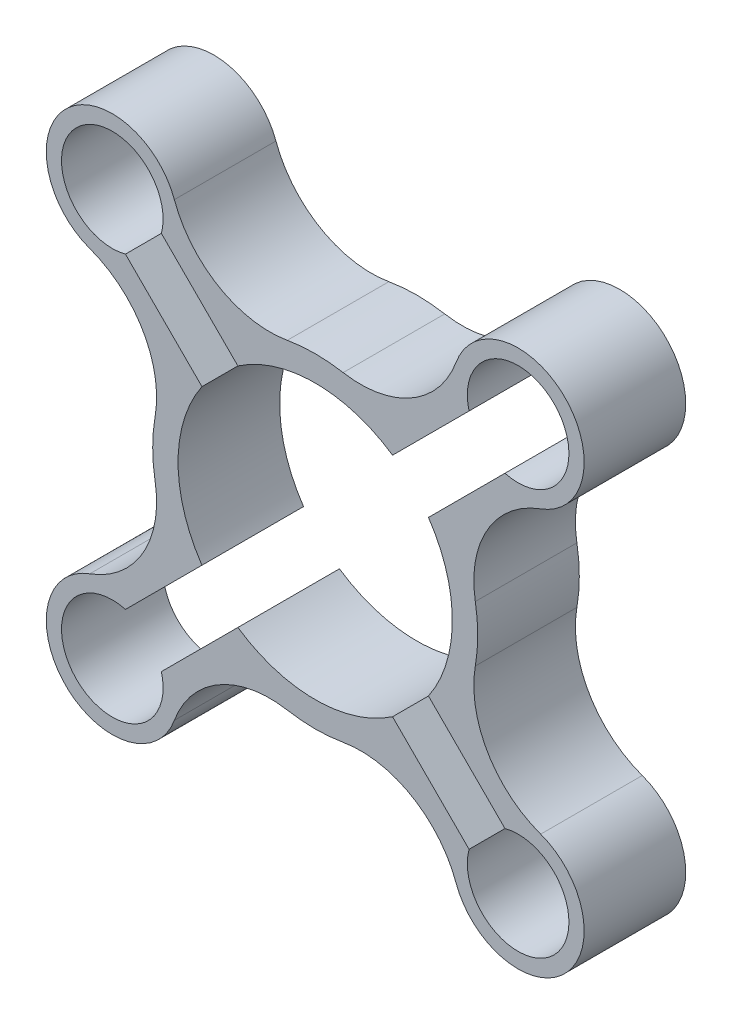
ISO-10303-21;
HEADER;
FILE_DESCRIPTION(('STEP AP214'),'2;1');
FILE_NAME('part.step','',(''),(''),'','','');
FILE_SCHEMA(('AUTOMOTIVE_DESIGN { 1 0 10303 214 1 1 1 1 }'));
ENDSEC;
DATA;
#1=APPLICATION_CONTEXT('core data for automotive mechanical design processes');
#2=APPLICATION_PROTOCOL_DEFINITION('international standard','automotive_design',2000,#1);
#3=PRODUCT_CONTEXT('',#1,'mechanical');
#4=PRODUCT('Part','Part','',(#3));
#5=PRODUCT_RELATED_PRODUCT_CATEGORY('part','',(#4));
#6=PRODUCT_DEFINITION_FORMATION('','',#4);
#7=PRODUCT_DEFINITION_CONTEXT('part definition',#1,'design');
#8=PRODUCT_DEFINITION('design','',#6,#7);
#9=PRODUCT_DEFINITION_SHAPE('','',#8);
#10=(LENGTH_UNIT() NAMED_UNIT(*) SI_UNIT(.MILLI.,.METRE.));
#11=(NAMED_UNIT(*) PLANE_ANGLE_UNIT() SI_UNIT($,.RADIAN.));
#12=(NAMED_UNIT(*) SI_UNIT($,.STERADIAN.) SOLID_ANGLE_UNIT());
#13=UNCERTAINTY_MEASURE_WITH_UNIT(LENGTH_MEASURE(1.E-05),#10,'distance_accuracy_value','');
#14=(GEOMETRIC_REPRESENTATION_CONTEXT(3) GLOBAL_UNCERTAINTY_ASSIGNED_CONTEXT((#13)) GLOBAL_UNIT_ASSIGNED_CONTEXT((#10,
#11,#12)) REPRESENTATION_CONTEXT('',''));
#15=CARTESIAN_POINT('',(0.,0.,0.));
#16=DIRECTION('',(0.,0.,1.));
#17=DIRECTION('',(1.,0.,0.));
#18=AXIS2_PLACEMENT_3D('',#15,#16,#17);
#19=CARTESIAN_POINT('',(4.46865767521816,25.6131040403484,10.));
#20=DIRECTION('',(0.,0.,-1.));
#21=DIRECTION('',(-1.,0.,0.));
#22=AXIS2_PLACEMENT_3D('',#19,#20,#21);
#23=PLANE('',#22);
#24=CARTESIAN_POINT('',(8.93731535043632,51.2262080806969,10.));
#25=DIRECTION('',(0.,0.,-1.));
#26=DIRECTION('',(-1.,0.,0.));
#27=AXIS2_PLACEMENT_3D('',#24,#25,#26);
#28=CIRCLE('',#27,20.);
#29=CARTESIAN_POINT('',(27.733810978681,44.3930717512078,10.));
#30=VERTEX_POINT('',#29);
#31=CARTESIAN_POINT('',(5.49988636949927,31.5238203573519,10.));
#32=VERTEX_POINT('',#31);
#33=EDGE_CURVE('E367',#30,#32,#28,.T.);
#34=ORIENTED_EDGE('',*,*,#33,.T.);
#35=CARTESIAN_POINT('',(0.,0.,10.));
#36=DIRECTION('',(0.,0.,1.));
#37=DIRECTION('',(1.,0.,0.));
#38=AXIS2_PLACEMENT_3D('',#35,#36,#37);
#39=CIRCLE('',#38,32.);
#40=CARTESIAN_POINT('',(-5.49988636949935,31.5238203573519,10.));
#41=VERTEX_POINT('',#40);
#42=EDGE_CURVE('E370',#32,#41,#39,.T.);
#43=ORIENTED_EDGE('',*,*,#42,.T.);
#44=CARTESIAN_POINT('',(-8.93731535043644,51.2262080806969,10.));
#45=DIRECTION('',(0.,0.,-1.));
#46=DIRECTION('',(1.,0.,0.));
#47=AXIS2_PLACEMENT_3D('',#44,#45,#46);
#48=CIRCLE('',#47,20.);
#49=CARTESIAN_POINT('',(-27.733810978681,44.3930717512078,10.));
#50=VERTEX_POINT('',#49);
#51=EDGE_CURVE('E373',#41,#50,#48,.T.);
#52=ORIENTED_EDGE('',*,*,#51,.T.);
#53=CARTESIAN_POINT('',(-39.9515331370399,39.9515331370399,10.));
#54=DIRECTION('',(0.,0.,1.));
#55=DIRECTION('',(1.,0.,0.));
#56=AXIS2_PLACEMENT_3D('',#53,#54,#55);
#57=CIRCLE('',#56,13.);
#58=CARTESIAN_POINT('',(-44.3930717512078,27.733810978681,10.));
#59=VERTEX_POINT('',#58);
#60=EDGE_CURVE('E375',#50,#59,#57,.T.);
#61=ORIENTED_EDGE('',*,*,#60,.T.);
#62=CARTESIAN_POINT('',(-51.2262080806969,8.9373153504364,10.));
#63=DIRECTION('',(0.,0.,-1.));
#64=DIRECTION('',(-1.,0.,0.));
#65=AXIS2_PLACEMENT_3D('',#62,#63,#64);
#66=CIRCLE('',#65,20.);
#67=CARTESIAN_POINT('',(-31.5238203573519,5.49988636949932,10.));
#68=VERTEX_POINT('',#67);
#69=EDGE_CURVE('E377',#59,#68,#66,.T.);
#70=ORIENTED_EDGE('',*,*,#69,.T.);
#71=CARTESIAN_POINT('',(0.,0.,10.));
#72=DIRECTION('',(0.,0.,1.));
#73=DIRECTION('',(1.,0.,0.));
#74=AXIS2_PLACEMENT_3D('',#71,#72,#73);
#75=CIRCLE('',#74,32.);
#76=CARTESIAN_POINT('',(-31.5238203573519,-5.49988636949934,10.));
#77=VERTEX_POINT('',#76);
#78=EDGE_CURVE('E379',#68,#77,#75,.T.);
#79=ORIENTED_EDGE('',*,*,#78,.T.);
#80=CARTESIAN_POINT('',(-51.2262080806969,-8.93731535043643,10.));
#81=DIRECTION('',(0.,0.,-1.));
#82=DIRECTION('',(1.,0.,0.));
#83=AXIS2_PLACEMENT_3D('',#80,#81,#82);
#84=CIRCLE('',#83,20.);
#85=CARTESIAN_POINT('',(-44.3930717512078,-27.733810978681,10.));
#86=VERTEX_POINT('',#85);
#87=EDGE_CURVE('E381',#77,#86,#84,.T.);
#88=ORIENTED_EDGE('',*,*,#87,.T.);
#89=CARTESIAN_POINT('',(-39.9515331370399,-39.9515331370399,10.));
#90=DIRECTION('',(0.,0.,1.));
#91=DIRECTION('',(1.,0.,0.));
#92=AXIS2_PLACEMENT_3D('',#89,#90,#91);
#93=CIRCLE('',#92,13.);
#94=CARTESIAN_POINT('',(-27.733810978681,-44.3930717512078,10.));
#95=VERTEX_POINT('',#94);
#96=EDGE_CURVE('E383',#86,#95,#93,.T.);
#97=ORIENTED_EDGE('',*,*,#96,.T.);
#98=CARTESIAN_POINT('',(-8.9373153504364,-51.2262080806969,10.));
#99=DIRECTION('',(0.,0.,-1.));
#100=DIRECTION('',(-1.,0.,0.));
#101=AXIS2_PLACEMENT_3D('',#98,#99,#100);
#102=CIRCLE('',#101,20.);
#103=CARTESIAN_POINT('',(-5.49988636949935,-31.5238203573519,10.));
#104=VERTEX_POINT('',#103);
#105=EDGE_CURVE('E385',#95,#104,#102,.T.);
#106=ORIENTED_EDGE('',*,*,#105,.T.);
#107=CARTESIAN_POINT('',(0.,0.,10.));
#108=DIRECTION('',(0.,0.,1.));
#109=DIRECTION('',(1.,0.,0.));
#110=AXIS2_PLACEMENT_3D('',#107,#108,#109);
#111=CIRCLE('',#110,32.);
#112=CARTESIAN_POINT('',(5.49988636949934,-31.5238203573519,10.));
#113=VERTEX_POINT('',#112);
#114=EDGE_CURVE('E387',#104,#113,#111,.T.);
#115=ORIENTED_EDGE('',*,*,#114,.T.);
#116=CARTESIAN_POINT('',(8.93731535043643,-51.2262080806969,10.));
#117=DIRECTION('',(0.,0.,-1.));
#118=DIRECTION('',(1.,0.,0.));
#119=AXIS2_PLACEMENT_3D('',#116,#117,#118);
#120=CIRCLE('',#119,20.);
#121=CARTESIAN_POINT('',(27.733810978681,-44.3930717512078,10.));
#122=VERTEX_POINT('',#121);
#123=EDGE_CURVE('E389',#113,#122,#120,.T.);
#124=ORIENTED_EDGE('',*,*,#123,.T.);
#125=CARTESIAN_POINT('',(39.9515331370399,-39.9515331370399,10.));
#126=DIRECTION('',(0.,0.,1.));
#127=DIRECTION('',(1.,0.,0.));
#128=AXIS2_PLACEMENT_3D('',#125,#126,#127);
#129=CIRCLE('',#128,13.);
#130=CARTESIAN_POINT('',(44.3930717512078,-27.733810978681,10.));
#131=VERTEX_POINT('',#130);
#132=EDGE_CURVE('E391',#122,#131,#129,.T.);
#133=ORIENTED_EDGE('',*,*,#132,.T.);
#134=CARTESIAN_POINT('',(51.2262080806969,-8.93731535043641,10.));
#135=DIRECTION('',(0.,0.,-1.));
#136=DIRECTION('',(-1.,0.,0.));
#137=AXIS2_PLACEMENT_3D('',#134,#135,#136);
#138=CIRCLE('',#137,20.);
#139=CARTESIAN_POINT('',(31.5238203573519,-5.49988636949932,10.));
#140=VERTEX_POINT('',#139);
#141=EDGE_CURVE('E393',#131,#140,#138,.T.);
#142=ORIENTED_EDGE('',*,*,#141,.T.);
#143=CARTESIAN_POINT('',(0.,0.,10.));
#144=DIRECTION('',(0.,0.,1.));
#145=DIRECTION('',(1.,0.,0.));
#146=AXIS2_PLACEMENT_3D('',#143,#144,#145);
#147=CIRCLE('',#146,32.);
#148=CARTESIAN_POINT('',(31.5238203573519,5.49988636949939,10.));
#149=VERTEX_POINT('',#148);
#150=EDGE_CURVE('E395',#140,#149,#147,.T.);
#151=ORIENTED_EDGE('',*,*,#150,.T.);
#152=CARTESIAN_POINT('',(51.2262080806969,8.93731535043651,10.));
#153=DIRECTION('',(0.,0.,-1.));
#154=DIRECTION('',(1.,0.,0.));
#155=AXIS2_PLACEMENT_3D('',#152,#153,#154);
#156=CIRCLE('',#155,20.);
#157=CARTESIAN_POINT('',(44.3930717512078,27.733810978681,10.));
#158=VERTEX_POINT('',#157);
#159=EDGE_CURVE('E397',#149,#158,#156,.T.);
#160=ORIENTED_EDGE('',*,*,#159,.T.);
#161=CARTESIAN_POINT('',(39.9515331370399,39.9515331370399,10.));
#162=DIRECTION('',(0.,0.,1.));
#163=DIRECTION('',(1.,0.,0.));
#164=AXIS2_PLACEMENT_3D('',#161,#162,#163);
#165=CIRCLE('',#164,13.);
#166=EDGE_CURVE('E399',#158,#30,#165,.T.);
#167=ORIENTED_EDGE('',*,*,#166,.T.);
#168=EDGE_LOOP('',(#34,#43,#52,#61,#70,#79,#88,#97,#106,#115,#124,#133,#142,#151,#160,#167));
#169=FACE_BOUND('',#168,.T.);
#170=CARTESIAN_POINT('',(39.9515331370399,39.9515331370399,10.));
#171=DIRECTION('',(0.,0.,1.));
#172=DIRECTION('',(1.,0.,0.));
#173=AXIS2_PLACEMENT_3D('',#170,#171,#172);
#174=CIRCLE('',#173,10.);
#175=CARTESIAN_POINT('',(37.3633426860147,30.2922748741493,10.));
#176=VERTEX_POINT('',#175);
#177=CARTESIAN_POINT('',(30.2922748741492,37.3633426860148,10.));
#178=VERTEX_POINT('',#177);
#179=EDGE_CURVE('E246',#176,#178,#174,.T.);
#180=ORIENTED_EDGE('',*,*,#179,.F.);
#181=DIRECTION('',(0.707106781186546,0.707106781186549,0.));
#182=VECTOR('',#181,1.);
#183=CARTESIAN_POINT('',(37.3633426860147,30.2922748741493,10.));
#184=LINE('',#183,#182);
#185=CARTESIAN_POINT('',(22.2971969452264,15.226129133361,10.));
#186=VERTEX_POINT('',#185);
#187=EDGE_CURVE('E295',#186,#176,#184,.T.);
#188=ORIENTED_EDGE('',*,*,#187,.F.);
#189=CARTESIAN_POINT('',(0.,0.,10.));
#190=DIRECTION('',(0.,0.,1.));
#191=DIRECTION('',(1.,0.,0.));
#192=AXIS2_PLACEMENT_3D('',#189,#190,#191);
#193=CIRCLE('',#192,27.);
#194=CARTESIAN_POINT('',(22.2971969452265,-15.226129133361,10.));
#195=VERTEX_POINT('',#194);
#196=EDGE_CURVE('E293',#195,#186,#193,.T.);
#197=ORIENTED_EDGE('',*,*,#196,.F.);
#198=DIRECTION('',(-0.707106781186547,0.707106781186548,0.));
#199=VECTOR('',#198,1.);
#200=CARTESIAN_POINT('',(37.3633426860147,-30.2922748741492,10.));
#201=LINE('',#200,#199);
#202=CARTESIAN_POINT('',(37.3633426860147,-30.2922748741492,10.));
#203=VERTEX_POINT('',#202);
#204=EDGE_CURVE('E291',#203,#195,#201,.T.);
#205=ORIENTED_EDGE('',*,*,#204,.F.);
#206=CARTESIAN_POINT('',(39.9515331370399,-39.9515331370399,10.));
#207=DIRECTION('',(0.,0.,1.));
#208=DIRECTION('',(1.,0.,0.));
#209=AXIS2_PLACEMENT_3D('',#206,#207,#208);
#210=CIRCLE('',#209,10.);
#211=CARTESIAN_POINT('',(30.2922748741493,-37.3633426860147,10.));
#212=VERTEX_POINT('',#211);
#213=EDGE_CURVE('E289',#212,#203,#210,.T.);
#214=ORIENTED_EDGE('',*,*,#213,.F.);
#215=DIRECTION('',(0.707106781186548,-0.707106781186547,0.));
#216=VECTOR('',#215,1.);
#217=CARTESIAN_POINT('',(30.2922748741493,-37.3633426860147,10.));
#218=LINE('',#217,#216);
#219=CARTESIAN_POINT('',(15.226129133361,-22.2971969452265,10.));
#220=VERTEX_POINT('',#219);
#221=EDGE_CURVE('E287',#220,#212,#218,.T.);
#222=ORIENTED_EDGE('',*,*,#221,.F.);
#223=CARTESIAN_POINT('',(0.,0.,10.));
#224=DIRECTION('',(0.,0.,1.));
#225=DIRECTION('',(1.,0.,0.));
#226=AXIS2_PLACEMENT_3D('',#223,#224,#225);
#227=CIRCLE('',#226,27.);
#228=CARTESIAN_POINT('',(-15.226129133361,-22.2971969452265,10.));
#229=VERTEX_POINT('',#228);
#230=EDGE_CURVE('E285',#229,#220,#227,.T.);
#231=ORIENTED_EDGE('',*,*,#230,.F.);
#232=DIRECTION('',(0.707106781186548,0.707106781186547,0.));
#233=VECTOR('',#232,1.);
#234=CARTESIAN_POINT('',(-30.2922748741492,-37.3633426860147,10.));
#235=LINE('',#234,#233);
#236=CARTESIAN_POINT('',(-30.2922748741492,-37.3633426860147,10.));
#237=VERTEX_POINT('',#236);
#238=EDGE_CURVE('E283',#237,#229,#235,.T.);
#239=ORIENTED_EDGE('',*,*,#238,.F.);
#240=CARTESIAN_POINT('',(-39.9515331370399,-39.9515331370399,10.));
#241=DIRECTION('',(0.,0.,1.));
#242=DIRECTION('',(1.,0.,0.));
#243=AXIS2_PLACEMENT_3D('',#240,#241,#242);
#244=CIRCLE('',#243,10.);
#245=CARTESIAN_POINT('',(-37.3633426860147,-30.2922748741493,10.));
#246=VERTEX_POINT('',#245);
#247=EDGE_CURVE('E281',#246,#237,#244,.T.);
#248=ORIENTED_EDGE('',*,*,#247,.F.);
#249=DIRECTION('',(-0.707106781186547,-0.707106781186548,0.));
#250=VECTOR('',#249,1.);
#251=CARTESIAN_POINT('',(-37.3633426860147,-30.2922748741493,10.));
#252=LINE('',#251,#250);
#253=CARTESIAN_POINT('',(-22.2971969452264,-15.226129133361,10.));
#254=VERTEX_POINT('',#253);
#255=EDGE_CURVE('E279',#254,#246,#252,.T.);
#256=ORIENTED_EDGE('',*,*,#255,.F.);
#257=CARTESIAN_POINT('',(0.,0.,10.));
#258=DIRECTION('',(0.,0.,1.));
#259=DIRECTION('',(1.,0.,0.));
#260=AXIS2_PLACEMENT_3D('',#257,#258,#259);
#261=CIRCLE('',#260,27.);
#262=CARTESIAN_POINT('',(-22.2971969452265,15.226129133361,10.));
#263=VERTEX_POINT('',#262);
#264=EDGE_CURVE('E277',#263,#254,#261,.T.);
#265=ORIENTED_EDGE('',*,*,#264,.F.);
#266=DIRECTION('',(0.707106781186547,-0.707106781186548,0.));
#267=VECTOR('',#266,1.);
#268=CARTESIAN_POINT('',(-37.3633426860147,30.2922748741492,10.));
#269=LINE('',#268,#267);
#270=CARTESIAN_POINT('',(-37.3633426860147,30.2922748741492,10.));
#271=VERTEX_POINT('',#270);
#272=EDGE_CURVE('E275',#271,#263,#269,.T.);
#273=ORIENTED_EDGE('',*,*,#272,.F.);
#274=CARTESIAN_POINT('',(-39.9515331370399,39.9515331370399,10.));
#275=DIRECTION('',(0.,0.,1.));
#276=DIRECTION('',(1.,0.,0.));
#277=AXIS2_PLACEMENT_3D('',#274,#275,#276);
#278=CIRCLE('',#277,10.);
#279=CARTESIAN_POINT('',(-30.2922748741493,37.3633426860147,10.));
#280=VERTEX_POINT('',#279);
#281=EDGE_CURVE('E273',#280,#271,#278,.T.);
#282=ORIENTED_EDGE('',*,*,#281,.F.);
#283=DIRECTION('',(-0.707106781186548,0.707106781186547,0.));
#284=VECTOR('',#283,1.);
#285=CARTESIAN_POINT('',(-30.2922748741493,37.3633426860147,10.));
#286=LINE('',#285,#284);
#287=CARTESIAN_POINT('',(-15.226129133361,22.2971969452264,10.));
#288=VERTEX_POINT('',#287);
#289=EDGE_CURVE('E269',#288,#280,#286,.T.);
#290=ORIENTED_EDGE('',*,*,#289,.F.);
#291=CARTESIAN_POINT('',(0.,0.,10.));
#292=DIRECTION('',(0.,0.,1.));
#293=DIRECTION('',(1.,0.,0.));
#294=AXIS2_PLACEMENT_3D('',#291,#292,#293);
#295=CIRCLE('',#294,27.);
#296=CARTESIAN_POINT('',(15.2261291333609,22.2971969452265,10.));
#297=VERTEX_POINT('',#296);
#298=EDGE_CURVE('E267',#297,#288,#295,.T.);
#299=ORIENTED_EDGE('',*,*,#298,.F.);
#300=DIRECTION('',(-0.707106781186546,-0.707106781186549,0.));
#301=VECTOR('',#300,1.);
#302=CARTESIAN_POINT('',(30.2922748741492,37.3633426860148,10.));
#303=LINE('',#302,#301);
#304=EDGE_CURVE('E254',#178,#297,#303,.T.);
#305=ORIENTED_EDGE('',*,*,#304,.F.);
#306=EDGE_LOOP('',(#180,#188,#197,#205,#214,#222,#231,#239,#248,#256,#265,#273,#282,#290,#299,#305));
#307=FACE_BOUND('',#306,.T.);
#308=ADVANCED_FACE('F37',(#169,#307),#23,.F.);
#309=CARTESIAN_POINT('',(4.46865767521816,25.6131040403484,-10.));
#310=DIRECTION('',(0.,0.,-1.));
#311=DIRECTION('',(-1.,0.,0.));
#312=AXIS2_PLACEMENT_3D('',#309,#310,#311);
#313=PLANE('',#312);
#314=CARTESIAN_POINT('',(8.93731535043632,51.2262080806969,-10.));
#315=DIRECTION('',(0.,0.,-1.));
#316=DIRECTION('',(-1.,0.,0.));
#317=AXIS2_PLACEMENT_3D('',#314,#315,#316);
#318=CIRCLE('',#317,20.);
#319=CARTESIAN_POINT('',(27.733810978681,44.3930717512078,-10.));
#320=VERTEX_POINT('',#319);
#321=CARTESIAN_POINT('',(5.49988636949927,31.5238203573519,-10.));
#322=VERTEX_POINT('',#321);
#323=EDGE_CURVE('E262',#320,#322,#318,.T.);
#324=ORIENTED_EDGE('',*,*,#323,.F.);
#325=CARTESIAN_POINT('',(39.9515331370399,39.9515331370399,-10.));
#326=DIRECTION('',(0.,0.,1.));
#327=DIRECTION('',(1.,0.,0.));
#328=AXIS2_PLACEMENT_3D('',#325,#326,#327);
#329=CIRCLE('',#328,13.);
#330=CARTESIAN_POINT('',(44.3930717512078,27.733810978681,-10.));
#331=VERTEX_POINT('',#330);
#332=EDGE_CURVE('E371',#331,#320,#329,.T.);
#333=ORIENTED_EDGE('',*,*,#332,.F.);
#334=CARTESIAN_POINT('',(51.2262080806969,8.93731535043651,-10.));
#335=DIRECTION('',(0.,0.,-1.));
#336=DIRECTION('',(1.,0.,0.));
#337=AXIS2_PLACEMENT_3D('',#334,#335,#336);
#338=CIRCLE('',#337,20.);
#339=CARTESIAN_POINT('',(31.5238203573519,5.49988636949939,-10.));
#340=VERTEX_POINT('',#339);
#341=EDGE_CURVE('E430',#340,#331,#338,.T.);
#342=ORIENTED_EDGE('',*,*,#341,.F.);
#343=CARTESIAN_POINT('',(0.,0.,-10.));
#344=DIRECTION('',(0.,0.,1.));
#345=DIRECTION('',(1.,0.,0.));
#346=AXIS2_PLACEMENT_3D('',#343,#344,#345);
#347=CIRCLE('',#346,32.);
#348=CARTESIAN_POINT('',(31.5238203573519,-5.49988636949932,-10.));
#349=VERTEX_POINT('',#348);
#350=EDGE_CURVE('E428',#349,#340,#347,.T.);
#351=ORIENTED_EDGE('',*,*,#350,.F.);
#352=CARTESIAN_POINT('',(51.2262080806969,-8.93731535043641,-10.));
#353=DIRECTION('',(0.,0.,-1.));
#354=DIRECTION('',(-1.,0.,0.));
#355=AXIS2_PLACEMENT_3D('',#352,#353,#354);
#356=CIRCLE('',#355,20.);
#357=CARTESIAN_POINT('',(44.3930717512078,-27.733810978681,-10.));
#358=VERTEX_POINT('',#357);
#359=EDGE_CURVE('E426',#358,#349,#356,.T.);
#360=ORIENTED_EDGE('',*,*,#359,.F.);
#361=CARTESIAN_POINT('',(39.9515331370399,-39.9515331370399,-10.));
#362=DIRECTION('',(0.,0.,1.));
#363=DIRECTION('',(1.,0.,0.));
#364=AXIS2_PLACEMENT_3D('',#361,#362,#363);
#365=CIRCLE('',#364,13.);
#366=CARTESIAN_POINT('',(27.733810978681,-44.3930717512078,-10.));
#367=VERTEX_POINT('',#366);
#368=EDGE_CURVE('E424',#367,#358,#365,.T.);
#369=ORIENTED_EDGE('',*,*,#368,.F.);
#370=CARTESIAN_POINT('',(8.93731535043643,-51.2262080806969,-10.));
#371=DIRECTION('',(0.,0.,-1.));
#372=DIRECTION('',(1.,0.,0.));
#373=AXIS2_PLACEMENT_3D('',#370,#371,#372);
#374=CIRCLE('',#373,20.);
#375=CARTESIAN_POINT('',(5.49988636949934,-31.5238203573519,-10.));
#376=VERTEX_POINT('',#375);
#377=EDGE_CURVE('E422',#376,#367,#374,.T.);
#378=ORIENTED_EDGE('',*,*,#377,.F.);
#379=CARTESIAN_POINT('',(0.,0.,-10.));
#380=DIRECTION('',(0.,0.,1.));
#381=DIRECTION('',(1.,0.,0.));
#382=AXIS2_PLACEMENT_3D('',#379,#380,#381);
#383=CIRCLE('',#382,32.);
#384=CARTESIAN_POINT('',(-5.49988636949935,-31.5238203573519,-10.));
#385=VERTEX_POINT('',#384);
#386=EDGE_CURVE('E420',#385,#376,#383,.T.);
#387=ORIENTED_EDGE('',*,*,#386,.F.);
#388=CARTESIAN_POINT('',(-8.9373153504364,-51.2262080806969,-10.));
#389=DIRECTION('',(0.,0.,-1.));
#390=DIRECTION('',(-1.,0.,0.));
#391=AXIS2_PLACEMENT_3D('',#388,#389,#390);
#392=CIRCLE('',#391,20.);
#393=CARTESIAN_POINT('',(-27.733810978681,-44.3930717512078,-10.));
#394=VERTEX_POINT('',#393);
#395=EDGE_CURVE('E418',#394,#385,#392,.T.);
#396=ORIENTED_EDGE('',*,*,#395,.F.);
#397=CARTESIAN_POINT('',(-39.9515331370399,-39.9515331370399,-10.));
#398=DIRECTION('',(0.,0.,1.));
#399=DIRECTION('',(1.,0.,0.));
#400=AXIS2_PLACEMENT_3D('',#397,#398,#399);
#401=CIRCLE('',#400,13.);
#402=CARTESIAN_POINT('',(-44.3930717512078,-27.733810978681,-10.));
#403=VERTEX_POINT('',#402);
#404=EDGE_CURVE('E416',#403,#394,#401,.T.);
#405=ORIENTED_EDGE('',*,*,#404,.F.);
#406=CARTESIAN_POINT('',(-51.2262080806969,-8.93731535043643,-10.));
#407=DIRECTION('',(0.,0.,-1.));
#408=DIRECTION('',(1.,0.,0.));
#409=AXIS2_PLACEMENT_3D('',#406,#407,#408);
#410=CIRCLE('',#409,20.);
#411=CARTESIAN_POINT('',(-31.5238203573519,-5.49988636949934,-10.));
#412=VERTEX_POINT('',#411);
#413=EDGE_CURVE('E414',#412,#403,#410,.T.);
#414=ORIENTED_EDGE('',*,*,#413,.F.);
#415=CARTESIAN_POINT('',(0.,0.,-10.));
#416=DIRECTION('',(0.,0.,1.));
#417=DIRECTION('',(1.,0.,0.));
#418=AXIS2_PLACEMENT_3D('',#415,#416,#417);
#419=CIRCLE('',#418,32.);
#420=CARTESIAN_POINT('',(-31.5238203573519,5.49988636949932,-10.));
#421=VERTEX_POINT('',#420);
#422=EDGE_CURVE('E412',#421,#412,#419,.T.);
#423=ORIENTED_EDGE('',*,*,#422,.F.);
#424=CARTESIAN_POINT('',(-51.2262080806969,8.9373153504364,-10.));
#425=DIRECTION('',(0.,0.,-1.));
#426=DIRECTION('',(-1.,0.,0.));
#427=AXIS2_PLACEMENT_3D('',#424,#425,#426);
#428=CIRCLE('',#427,20.);
#429=CARTESIAN_POINT('',(-44.3930717512078,27.733810978681,-10.));
#430=VERTEX_POINT('',#429);
#431=EDGE_CURVE('E410',#430,#421,#428,.T.);
#432=ORIENTED_EDGE('',*,*,#431,.F.);
#433=CARTESIAN_POINT('',(-39.9515331370399,39.9515331370399,-10.));
#434=DIRECTION('',(0.,0.,1.));
#435=DIRECTION('',(1.,0.,0.));
#436=AXIS2_PLACEMENT_3D('',#433,#434,#435);
#437=CIRCLE('',#436,13.);
#438=CARTESIAN_POINT('',(-27.733810978681,44.3930717512078,-10.));
#439=VERTEX_POINT('',#438);
#440=EDGE_CURVE('E408',#439,#430,#437,.T.);
#441=ORIENTED_EDGE('',*,*,#440,.F.);
#442=CARTESIAN_POINT('',(-8.93731535043644,51.2262080806969,-10.));
#443=DIRECTION('',(0.,0.,-1.));
#444=DIRECTION('',(1.,0.,0.));
#445=AXIS2_PLACEMENT_3D('',#442,#443,#444);
#446=CIRCLE('',#445,20.);
#447=CARTESIAN_POINT('',(-5.49988636949935,31.5238203573519,-10.));
#448=VERTEX_POINT('',#447);
#449=EDGE_CURVE('E406',#448,#439,#446,.T.);
#450=ORIENTED_EDGE('',*,*,#449,.F.);
#451=CARTESIAN_POINT('',(0.,0.,-10.));
#452=DIRECTION('',(0.,0.,1.));
#453=DIRECTION('',(1.,0.,0.));
#454=AXIS2_PLACEMENT_3D('',#451,#452,#453);
#455=CIRCLE('',#454,32.);
#456=EDGE_CURVE('E404',#322,#448,#455,.T.);
#457=ORIENTED_EDGE('',*,*,#456,.F.);
#458=EDGE_LOOP('',(#324,#333,#342,#351,#360,#369,#378,#387,#396,#405,#414,#423,#432,#441,#450,#457));
#459=FACE_BOUND('',#458,.T.);
#460=DIRECTION('',(0.707106781186546,0.707106781186549,0.));
#461=VECTOR('',#460,1.);
#462=CARTESIAN_POINT('',(37.3633426860147,30.2922748741493,-10.));
#463=LINE('',#462,#461);
#464=CARTESIAN_POINT('',(22.2971969452264,15.226129133361,-10.));
#465=VERTEX_POINT('',#464);
#466=CARTESIAN_POINT('',(37.3633426860147,30.2922748741493,-10.));
#467=VERTEX_POINT('',#466);
#468=EDGE_CURVE('E255',#465,#467,#463,.T.);
#469=ORIENTED_EDGE('',*,*,#468,.T.);
#470=CARTESIAN_POINT('',(39.9515331370399,39.9515331370399,-10.));
#471=DIRECTION('',(0.,0.,1.));
#472=DIRECTION('',(1.,0.,0.));
#473=AXIS2_PLACEMENT_3D('',#470,#471,#472);
#474=CIRCLE('',#473,10.);
#475=CARTESIAN_POINT('',(30.2922748741492,37.3633426860148,-10.));
#476=VERTEX_POINT('',#475);
#477=EDGE_CURVE('E60',#467,#476,#474,.T.);
#478=ORIENTED_EDGE('',*,*,#477,.T.);
#479=DIRECTION('',(-0.707106781186546,-0.707106781186549,0.));
#480=VECTOR('',#479,1.);
#481=CARTESIAN_POINT('',(30.2922748741492,37.3633426860148,-10.));
#482=LINE('',#481,#480);
#483=CARTESIAN_POINT('',(15.2261291333609,22.2971969452265,-10.));
#484=VERTEX_POINT('',#483);
#485=EDGE_CURVE('E261',#476,#484,#482,.T.);
#486=ORIENTED_EDGE('',*,*,#485,.T.);
#487=CARTESIAN_POINT('',(0.,0.,-10.));
#488=DIRECTION('',(0.,0.,1.));
#489=DIRECTION('',(1.,0.,0.));
#490=AXIS2_PLACEMENT_3D('',#487,#488,#489);
#491=CIRCLE('',#490,27.);
#492=CARTESIAN_POINT('',(-15.226129133361,22.2971969452264,-10.));
#493=VERTEX_POINT('',#492);
#494=EDGE_CURVE('E299',#484,#493,#491,.T.);
#495=ORIENTED_EDGE('',*,*,#494,.T.);
#496=DIRECTION('',(-0.707106781186548,0.707106781186547,0.));
#497=VECTOR('',#496,1.);
#498=CARTESIAN_POINT('',(-30.2922748741493,37.3633426860147,-10.));
#499=LINE('',#498,#497);
#500=CARTESIAN_POINT('',(-30.2922748741493,37.3633426860147,-10.));
#501=VERTEX_POINT('',#500);
#502=EDGE_CURVE('E302',#493,#501,#499,.T.);
#503=ORIENTED_EDGE('',*,*,#502,.T.);
#504=CARTESIAN_POINT('',(-39.9515331370399,39.9515331370399,-10.));
#505=DIRECTION('',(0.,0.,1.));
#506=DIRECTION('',(1.,0.,0.));
#507=AXIS2_PLACEMENT_3D('',#504,#505,#506);
#508=CIRCLE('',#507,10.);
#509=CARTESIAN_POINT('',(-37.3633426860147,30.2922748741492,-10.));
#510=VERTEX_POINT('',#509);
#511=EDGE_CURVE('E305',#501,#510,#508,.T.);
#512=ORIENTED_EDGE('',*,*,#511,.T.);
#513=DIRECTION('',(0.707106781186547,-0.707106781186548,0.));
#514=VECTOR('',#513,1.);
#515=CARTESIAN_POINT('',(-37.3633426860147,30.2922748741492,-10.));
#516=LINE('',#515,#514);
#517=CARTESIAN_POINT('',(-22.2971969452265,15.226129133361,-10.));
#518=VERTEX_POINT('',#517);
#519=EDGE_CURVE('E308',#510,#518,#516,.T.);
#520=ORIENTED_EDGE('',*,*,#519,.T.);
#521=CARTESIAN_POINT('',(0.,0.,-10.));
#522=DIRECTION('',(0.,0.,1.));
#523=DIRECTION('',(1.,0.,0.));
#524=AXIS2_PLACEMENT_3D('',#521,#522,#523);
#525=CIRCLE('',#524,27.);
#526=CARTESIAN_POINT('',(-22.2971969452264,-15.226129133361,-10.));
#527=VERTEX_POINT('',#526);
#528=EDGE_CURVE('E311',#518,#527,#525,.T.);
#529=ORIENTED_EDGE('',*,*,#528,.T.);
#530=DIRECTION('',(-0.707106781186547,-0.707106781186548,0.));
#531=VECTOR('',#530,1.);
#532=CARTESIAN_POINT('',(-37.3633426860147,-30.2922748741493,-10.));
#533=LINE('',#532,#531);
#534=CARTESIAN_POINT('',(-37.3633426860147,-30.2922748741493,-10.));
#535=VERTEX_POINT('',#534);
#536=EDGE_CURVE('E314',#527,#535,#533,.T.);
#537=ORIENTED_EDGE('',*,*,#536,.T.);
#538=CARTESIAN_POINT('',(-39.9515331370399,-39.9515331370399,-10.));
#539=DIRECTION('',(0.,0.,1.));
#540=DIRECTION('',(1.,0.,0.));
#541=AXIS2_PLACEMENT_3D('',#538,#539,#540);
#542=CIRCLE('',#541,10.);
#543=CARTESIAN_POINT('',(-30.2922748741492,-37.3633426860147,-10.));
#544=VERTEX_POINT('',#543);
#545=EDGE_CURVE('E317',#535,#544,#542,.T.);
#546=ORIENTED_EDGE('',*,*,#545,.T.);
#547=DIRECTION('',(0.707106781186548,0.707106781186547,0.));
#548=VECTOR('',#547,1.);
#549=CARTESIAN_POINT('',(-30.2922748741492,-37.3633426860147,-10.));
#550=LINE('',#549,#548);
#551=CARTESIAN_POINT('',(-15.226129133361,-22.2971969452265,-10.));
#552=VERTEX_POINT('',#551);
#553=EDGE_CURVE('E320',#544,#552,#550,.T.);
#554=ORIENTED_EDGE('',*,*,#553,.T.);
#555=CARTESIAN_POINT('',(0.,0.,-10.));
#556=DIRECTION('',(0.,0.,1.));
#557=DIRECTION('',(1.,0.,0.));
#558=AXIS2_PLACEMENT_3D('',#555,#556,#557);
#559=CIRCLE('',#558,27.);
#560=CARTESIAN_POINT('',(15.226129133361,-22.2971969452265,-10.));
#561=VERTEX_POINT('',#560);
#562=EDGE_CURVE('E323',#552,#561,#559,.T.);
#563=ORIENTED_EDGE('',*,*,#562,.T.);
#564=DIRECTION('',(0.707106781186548,-0.707106781186547,0.));
#565=VECTOR('',#564,1.);
#566=CARTESIAN_POINT('',(30.2922748741493,-37.3633426860147,-10.));
#567=LINE('',#566,#565);
#568=CARTESIAN_POINT('',(30.2922748741493,-37.3633426860147,-10.));
#569=VERTEX_POINT('',#568);
#570=EDGE_CURVE('E326',#561,#569,#567,.T.);
#571=ORIENTED_EDGE('',*,*,#570,.T.);
#572=CARTESIAN_POINT('',(39.9515331370399,-39.9515331370399,-10.));
#573=DIRECTION('',(0.,0.,1.));
#574=DIRECTION('',(1.,0.,0.));
#575=AXIS2_PLACEMENT_3D('',#572,#573,#574);
#576=CIRCLE('',#575,10.);
#577=CARTESIAN_POINT('',(37.3633426860147,-30.2922748741492,-10.));
#578=VERTEX_POINT('',#577);
#579=EDGE_CURVE('E329',#569,#578,#576,.T.);
#580=ORIENTED_EDGE('',*,*,#579,.T.);
#581=DIRECTION('',(-0.707106781186547,0.707106781186548,0.));
#582=VECTOR('',#581,1.);
#583=CARTESIAN_POINT('',(37.3633426860147,-30.2922748741492,-10.));
#584=LINE('',#583,#582);
#585=CARTESIAN_POINT('',(22.2971969452265,-15.226129133361,-10.));
#586=VERTEX_POINT('',#585);
#587=EDGE_CURVE('E332',#578,#586,#584,.T.);
#588=ORIENTED_EDGE('',*,*,#587,.T.);
#589=CARTESIAN_POINT('',(0.,0.,-10.));
#590=DIRECTION('',(0.,0.,1.));
#591=DIRECTION('',(1.,0.,0.));
#592=AXIS2_PLACEMENT_3D('',#589,#590,#591);
#593=CIRCLE('',#592,27.);
#594=EDGE_CURVE('E335',#586,#465,#593,.T.);
#595=ORIENTED_EDGE('',*,*,#594,.T.);
#596=EDGE_LOOP('',(#469,#478,#486,#495,#503,#512,#520,#529,#537,#546,#554,#563,#571,#580,#588,#595));
#597=FACE_BOUND('',#596,.T.);
#598=ADVANCED_FACE('F484',(#459,#597),#313,.T.);
#599=CARTESIAN_POINT('',(8.93731535043632,51.2262080806969,10.));
#600=DIRECTION('',(0.,0.,-1.));
#601=DIRECTION('',(-1.,0.,0.));
#602=AXIS2_PLACEMENT_3D('',#599,#600,#601);
#603=CYLINDRICAL_SURFACE('',#602,20.);
#604=ORIENTED_EDGE('',*,*,#323,.T.);
#605=DIRECTION('',(0.,0.,-1.));
#606=VECTOR('',#605,1.);
#607=CARTESIAN_POINT('',(5.49988636949927,31.5238203573519,10.));
#608=LINE('',#607,#606);
#609=EDGE_CURVE('E11',#32,#322,#608,.T.);
#610=ORIENTED_EDGE('',*,*,#609,.F.);
#611=ORIENTED_EDGE('',*,*,#33,.F.);
#612=DIRECTION('',(0.,0.,-1.));
#613=VECTOR('',#612,1.);
#614=CARTESIAN_POINT('',(27.733810978681,44.3930717512078,10.));
#615=LINE('',#614,#613);
#616=EDGE_CURVE('E401',#30,#320,#615,.T.);
#617=ORIENTED_EDGE('',*,*,#616,.T.);
#618=EDGE_LOOP('',(#604,#610,#611,#617));
#619=FACE_BOUND('',#618,.T.);
#620=ADVANCED_FACE('F39',(#619),#603,.F.);
#621=CARTESIAN_POINT('',(0.,0.,10.));
#622=DIRECTION('',(0.,0.,-1.));
#623=DIRECTION('',(-1.,0.,0.));
#624=AXIS2_PLACEMENT_3D('',#621,#622,#623);
#625=CYLINDRICAL_SURFACE('',#624,32.);
#626=ORIENTED_EDGE('',*,*,#456,.T.);
#627=DIRECTION('',(0.,0.,-1.));
#628=VECTOR('',#627,1.);
#629=CARTESIAN_POINT('',(-5.49988636949935,31.5238203573519,10.));
#630=LINE('',#629,#628);
#631=EDGE_CURVE('E45',#41,#448,#630,.T.);
#632=ORIENTED_EDGE('',*,*,#631,.F.);
#633=ORIENTED_EDGE('',*,*,#42,.F.);
#634=ORIENTED_EDGE('',*,*,#609,.T.);
#635=EDGE_LOOP('',(#626,#632,#633,#634));
#636=FACE_BOUND('',#635,.T.);
#637=ADVANCED_FACE('F501',(#636),#625,.T.);
#638=CARTESIAN_POINT('',(-8.93731535043644,51.2262080806969,10.));
#639=DIRECTION('',(0.,0.,-1.));
#640=DIRECTION('',(-1.,0.,0.));
#641=AXIS2_PLACEMENT_3D('',#638,#639,#640);
#642=CYLINDRICAL_SURFACE('',#641,20.);
#643=ORIENTED_EDGE('',*,*,#449,.T.);
#644=DIRECTION('',(0.,0.,-1.));
#645=VECTOR('',#644,1.);
#646=CARTESIAN_POINT('',(-27.733810978681,44.3930717512078,10.));
#647=LINE('',#646,#645);
#648=EDGE_CURVE('E471',#50,#439,#647,.T.);
#649=ORIENTED_EDGE('',*,*,#648,.F.);
#650=ORIENTED_EDGE('',*,*,#51,.F.);
#651=ORIENTED_EDGE('',*,*,#631,.T.);
#652=EDGE_LOOP('',(#643,#649,#650,#651));
#653=FACE_BOUND('',#652,.T.);
#654=ADVANCED_FACE('F478',(#653),#642,.F.);
#655=CARTESIAN_POINT('',(-39.9515331370399,39.9515331370399,10.));
#656=DIRECTION('',(0.,0.,-1.));
#657=DIRECTION('',(-1.,0.,0.));
#658=AXIS2_PLACEMENT_3D('',#655,#656,#657);
#659=CYLINDRICAL_SURFACE('',#658,13.);
#660=ORIENTED_EDGE('',*,*,#440,.T.);
#661=DIRECTION('',(0.,0.,-1.));
#662=VECTOR('',#661,1.);
#663=CARTESIAN_POINT('',(-44.3930717512078,27.733810978681,10.));
#664=LINE('',#663,#662);
#665=EDGE_CURVE('E468',#59,#430,#664,.T.);
#666=ORIENTED_EDGE('',*,*,#665,.F.);
#667=ORIENTED_EDGE('',*,*,#60,.F.);
#668=ORIENTED_EDGE('',*,*,#648,.T.);
#669=EDGE_LOOP('',(#660,#666,#667,#668));
#670=FACE_BOUND('',#669,.T.);
#671=ADVANCED_FACE('F490',(#670),#659,.T.);
#672=CARTESIAN_POINT('',(-51.2262080806969,8.9373153504364,10.));
#673=DIRECTION('',(0.,0.,-1.));
#674=DIRECTION('',(-1.,0.,0.));
#675=AXIS2_PLACEMENT_3D('',#672,#673,#674);
#676=CYLINDRICAL_SURFACE('',#675,20.);
#677=ORIENTED_EDGE('',*,*,#431,.T.);
#678=DIRECTION('',(0.,0.,-1.));
#679=VECTOR('',#678,1.);
#680=CARTESIAN_POINT('',(-31.5238203573519,5.49988636949932,10.));
#681=LINE('',#680,#679);
#682=EDGE_CURVE('E465',#68,#421,#681,.T.);
#683=ORIENTED_EDGE('',*,*,#682,.F.);
#684=ORIENTED_EDGE('',*,*,#69,.F.);
#685=ORIENTED_EDGE('',*,*,#665,.T.);
#686=EDGE_LOOP('',(#677,#683,#684,#685));
#687=FACE_BOUND('',#686,.T.);
#688=ADVANCED_FACE('F494',(#687),#676,.F.);
#689=CARTESIAN_POINT('',(0.,0.,10.));
#690=DIRECTION('',(0.,0.,-1.));
#691=DIRECTION('',(-1.,0.,0.));
#692=AXIS2_PLACEMENT_3D('',#689,#690,#691);
#693=CYLINDRICAL_SURFACE('',#692,32.);
#694=ORIENTED_EDGE('',*,*,#422,.T.);
#695=DIRECTION('',(0.,0.,-1.));
#696=VECTOR('',#695,1.);
#697=CARTESIAN_POINT('',(-31.5238203573519,-5.49988636949934,10.));
#698=LINE('',#697,#696);
#699=EDGE_CURVE('E462',#77,#412,#698,.T.);
#700=ORIENTED_EDGE('',*,*,#699,.F.);
#701=ORIENTED_EDGE('',*,*,#78,.F.);
#702=ORIENTED_EDGE('',*,*,#682,.T.);
#703=EDGE_LOOP('',(#694,#700,#701,#702));
#704=FACE_BOUND('',#703,.T.);
#705=ADVANCED_FACE('F554',(#704),#693,.T.);
#706=CARTESIAN_POINT('',(-51.2262080806969,-8.93731535043643,10.));
#707=DIRECTION('',(0.,0.,-1.));
#708=DIRECTION('',(-1.,0.,0.));
#709=AXIS2_PLACEMENT_3D('',#706,#707,#708);
#710=CYLINDRICAL_SURFACE('',#709,20.);
#711=ORIENTED_EDGE('',*,*,#413,.T.);
#712=DIRECTION('',(0.,0.,-1.));
#713=VECTOR('',#712,1.);
#714=CARTESIAN_POINT('',(-44.3930717512078,-27.733810978681,10.));
#715=LINE('',#714,#713);
#716=EDGE_CURVE('E459',#86,#403,#715,.T.);
#717=ORIENTED_EDGE('',*,*,#716,.F.);
#718=ORIENTED_EDGE('',*,*,#87,.F.);
#719=ORIENTED_EDGE('',*,*,#699,.T.);
#720=EDGE_LOOP('',(#711,#717,#718,#719));
#721=FACE_BOUND('',#720,.T.);
#722=ADVANCED_FACE('F551',(#721),#710,.F.);
#723=CARTESIAN_POINT('',(-39.9515331370399,-39.9515331370399,10.));
#724=DIRECTION('',(0.,0.,-1.));
#725=DIRECTION('',(-1.,0.,0.));
#726=AXIS2_PLACEMENT_3D('',#723,#724,#725);
#727=CYLINDRICAL_SURFACE('',#726,13.);
#728=ORIENTED_EDGE('',*,*,#404,.T.);
#729=DIRECTION('',(0.,0.,-1.));
#730=VECTOR('',#729,1.);
#731=CARTESIAN_POINT('',(-27.733810978681,-44.3930717512078,10.));
#732=LINE('',#731,#730);
#733=EDGE_CURVE('E456',#95,#394,#732,.T.);
#734=ORIENTED_EDGE('',*,*,#733,.F.);
#735=ORIENTED_EDGE('',*,*,#96,.F.);
#736=ORIENTED_EDGE('',*,*,#716,.T.);
#737=EDGE_LOOP('',(#728,#734,#735,#736));
#738=FACE_BOUND('',#737,.T.);
#739=ADVANCED_FACE('F547',(#738),#727,.T.);
#740=CARTESIAN_POINT('',(-8.9373153504364,-51.2262080806969,10.));
#741=DIRECTION('',(0.,0.,-1.));
#742=DIRECTION('',(-1.,0.,0.));
#743=AXIS2_PLACEMENT_3D('',#740,#741,#742);
#744=CYLINDRICAL_SURFACE('',#743,20.);
#745=ORIENTED_EDGE('',*,*,#395,.T.);
#746=DIRECTION('',(0.,0.,-1.));
#747=VECTOR('',#746,1.);
#748=CARTESIAN_POINT('',(-5.49988636949935,-31.5238203573519,10.));
#749=LINE('',#748,#747);
#750=EDGE_CURVE('E453',#104,#385,#749,.T.);
#751=ORIENTED_EDGE('',*,*,#750,.F.);
#752=ORIENTED_EDGE('',*,*,#105,.F.);
#753=ORIENTED_EDGE('',*,*,#733,.T.);
#754=EDGE_LOOP('',(#745,#751,#752,#753));
#755=FACE_BOUND('',#754,.T.);
#756=ADVANCED_FACE('F543',(#755),#744,.F.);
#757=CARTESIAN_POINT('',(0.,0.,10.));
#758=DIRECTION('',(0.,0.,-1.));
#759=DIRECTION('',(-1.,0.,0.));
#760=AXIS2_PLACEMENT_3D('',#757,#758,#759);
#761=CYLINDRICAL_SURFACE('',#760,32.);
#762=ORIENTED_EDGE('',*,*,#386,.T.);
#763=DIRECTION('',(0.,0.,-1.));
#764=VECTOR('',#763,1.);
#765=CARTESIAN_POINT('',(5.49988636949934,-31.5238203573519,10.));
#766=LINE('',#765,#764);
#767=EDGE_CURVE('E450',#113,#376,#766,.T.);
#768=ORIENTED_EDGE('',*,*,#767,.F.);
#769=ORIENTED_EDGE('',*,*,#114,.F.);
#770=ORIENTED_EDGE('',*,*,#750,.T.);
#771=EDGE_LOOP('',(#762,#768,#769,#770));
#772=FACE_BOUND('',#771,.T.);
#773=ADVANCED_FACE('F538',(#772),#761,.T.);
#774=CARTESIAN_POINT('',(8.93731535043643,-51.2262080806969,10.));
#775=DIRECTION('',(0.,0.,-1.));
#776=DIRECTION('',(-1.,0.,0.));
#777=AXIS2_PLACEMENT_3D('',#774,#775,#776);
#778=CYLINDRICAL_SURFACE('',#777,20.);
#779=ORIENTED_EDGE('',*,*,#377,.T.);
#780=DIRECTION('',(0.,0.,-1.));
#781=VECTOR('',#780,1.);
#782=CARTESIAN_POINT('',(27.733810978681,-44.3930717512078,10.));
#783=LINE('',#782,#781);
#784=EDGE_CURVE('E447',#122,#367,#783,.T.);
#785=ORIENTED_EDGE('',*,*,#784,.F.);
#786=ORIENTED_EDGE('',*,*,#123,.F.);
#787=ORIENTED_EDGE('',*,*,#767,.T.);
#788=EDGE_LOOP('',(#779,#785,#786,#787));
#789=FACE_BOUND('',#788,.T.);
#790=ADVANCED_FACE('F532',(#789),#778,.F.);
#791=CARTESIAN_POINT('',(39.9515331370399,-39.9515331370399,10.));
#792=DIRECTION('',(0.,0.,-1.));
#793=DIRECTION('',(-1.,0.,0.));
#794=AXIS2_PLACEMENT_3D('',#791,#792,#793);
#795=CYLINDRICAL_SURFACE('',#794,13.);
#796=ORIENTED_EDGE('',*,*,#368,.T.);
#797=DIRECTION('',(0.,0.,-1.));
#798=VECTOR('',#797,1.);
#799=CARTESIAN_POINT('',(44.3930717512078,-27.733810978681,10.));
#800=LINE('',#799,#798);
#801=EDGE_CURVE('E444',#131,#358,#800,.T.);
#802=ORIENTED_EDGE('',*,*,#801,.F.);
#803=ORIENTED_EDGE('',*,*,#132,.F.);
#804=ORIENTED_EDGE('',*,*,#784,.T.);
#805=EDGE_LOOP('',(#796,#802,#803,#804));
#806=FACE_BOUND('',#805,.T.);
#807=ADVANCED_FACE('F528',(#806),#795,.T.);
#808=CARTESIAN_POINT('',(51.2262080806969,-8.93731535043641,10.));
#809=DIRECTION('',(0.,0.,-1.));
#810=DIRECTION('',(-1.,0.,0.));
#811=AXIS2_PLACEMENT_3D('',#808,#809,#810);
#812=CYLINDRICAL_SURFACE('',#811,20.);
#813=ORIENTED_EDGE('',*,*,#359,.T.);
#814=DIRECTION('',(0.,0.,-1.));
#815=VECTOR('',#814,1.);
#816=CARTESIAN_POINT('',(31.5238203573519,-5.49988636949932,10.));
#817=LINE('',#816,#815);
#818=EDGE_CURVE('E441',#140,#349,#817,.T.);
#819=ORIENTED_EDGE('',*,*,#818,.F.);
#820=ORIENTED_EDGE('',*,*,#141,.F.);
#821=ORIENTED_EDGE('',*,*,#801,.T.);
#822=EDGE_LOOP('',(#813,#819,#820,#821));
#823=FACE_BOUND('',#822,.T.);
#824=ADVANCED_FACE('F523',(#823),#812,.F.);
#825=CARTESIAN_POINT('',(0.,0.,10.));
#826=DIRECTION('',(0.,0.,-1.));
#827=DIRECTION('',(-1.,0.,0.));
#828=AXIS2_PLACEMENT_3D('',#825,#826,#827);
#829=CYLINDRICAL_SURFACE('',#828,32.);
#830=ORIENTED_EDGE('',*,*,#350,.T.);
#831=DIRECTION('',(0.,0.,-1.));
#832=VECTOR('',#831,1.);
#833=CARTESIAN_POINT('',(31.5238203573519,5.49988636949939,10.));
#834=LINE('',#833,#832);
#835=EDGE_CURVE('E438',#149,#340,#834,.T.);
#836=ORIENTED_EDGE('',*,*,#835,.F.);
#837=ORIENTED_EDGE('',*,*,#150,.F.);
#838=ORIENTED_EDGE('',*,*,#818,.T.);
#839=EDGE_LOOP('',(#830,#836,#837,#838));
#840=FACE_BOUND('',#839,.T.);
#841=ADVANCED_FACE('F517',(#840),#829,.T.);
#842=CARTESIAN_POINT('',(51.2262080806969,8.93731535043651,10.));
#843=DIRECTION('',(0.,0.,-1.));
#844=DIRECTION('',(-1.,0.,0.));
#845=AXIS2_PLACEMENT_3D('',#842,#843,#844);
#846=CYLINDRICAL_SURFACE('',#845,20.);
#847=ORIENTED_EDGE('',*,*,#341,.T.);
#848=DIRECTION('',(0.,0.,-1.));
#849=VECTOR('',#848,1.);
#850=CARTESIAN_POINT('',(44.3930717512078,27.733810978681,10.));
#851=LINE('',#850,#849);
#852=EDGE_CURVE('E435',#158,#331,#851,.T.);
#853=ORIENTED_EDGE('',*,*,#852,.F.);
#854=ORIENTED_EDGE('',*,*,#159,.F.);
#855=ORIENTED_EDGE('',*,*,#835,.T.);
#856=EDGE_LOOP('',(#847,#853,#854,#855));
#857=FACE_BOUND('',#856,.T.);
#858=ADVANCED_FACE('F513',(#857),#846,.F.);
#859=CARTESIAN_POINT('',(39.9515331370399,39.9515331370399,10.));
#860=DIRECTION('',(0.,0.,-1.));
#861=DIRECTION('',(-1.,0.,0.));
#862=AXIS2_PLACEMENT_3D('',#859,#860,#861);
#863=CYLINDRICAL_SURFACE('',#862,13.);
#864=ORIENTED_EDGE('',*,*,#332,.T.);
#865=ORIENTED_EDGE('',*,*,#616,.F.);
#866=ORIENTED_EDGE('',*,*,#166,.F.);
#867=ORIENTED_EDGE('',*,*,#852,.T.);
#868=EDGE_LOOP('',(#864,#865,#866,#867));
#869=FACE_BOUND('',#868,.T.);
#870=ADVANCED_FACE('F508',(#869),#863,.T.);
#871=CARTESIAN_POINT('',(39.9515331370399,39.9515331370399,10.));
#872=DIRECTION('',(0.,0.,-1.));
#873=DIRECTION('',(-1.,0.,0.));
#874=AXIS2_PLACEMENT_3D('',#871,#872,#873);
#875=CYLINDRICAL_SURFACE('',#874,10.);
#876=ORIENTED_EDGE('',*,*,#477,.F.);
#877=DIRECTION('',(0.,0.,-1.));
#878=VECTOR('',#877,1.);
#879=CARTESIAN_POINT('',(37.3633426860147,30.2922748741493,10.));
#880=LINE('',#879,#878);
#881=EDGE_CURVE('E250',#176,#467,#880,.T.);
#882=ORIENTED_EDGE('',*,*,#881,.F.);
#883=ORIENTED_EDGE('',*,*,#179,.T.);
#884=DIRECTION('',(0.,0.,-1.));
#885=VECTOR('',#884,1.);
#886=CARTESIAN_POINT('',(30.2922748741492,37.3633426860148,10.));
#887=LINE('',#886,#885);
#888=EDGE_CURVE('E249',#178,#476,#887,.T.);
#889=ORIENTED_EDGE('',*,*,#888,.T.);
#890=EDGE_LOOP('',(#876,#882,#883,#889));
#891=FACE_BOUND('',#890,.T.);
#892=ADVANCED_FACE('F248',(#891),#875,.F.);
#893=CARTESIAN_POINT('',(30.2922748741492,37.3633426860148,10.));
#894=DIRECTION('',(0.707106781186549,-0.707106781186546,0.));
#895=DIRECTION('',(0.707106781186546,0.707106781186549,0.));
#896=AXIS2_PLACEMENT_3D('',#893,#894,#895);
#897=PLANE('',#896);
#898=ORIENTED_EDGE('',*,*,#485,.F.);
#899=ORIENTED_EDGE('',*,*,#888,.F.);
#900=ORIENTED_EDGE('',*,*,#304,.T.);
#901=DIRECTION('',(0.,0.,-1.));
#902=VECTOR('',#901,1.);
#903=CARTESIAN_POINT('',(15.2261291333609,22.2971969452265,10.));
#904=LINE('',#903,#902);
#905=EDGE_CURVE('E263',#297,#484,#904,.T.);
#906=ORIENTED_EDGE('',*,*,#905,.T.);
#907=EDGE_LOOP('',(#898,#899,#900,#906));
#908=FACE_BOUND('',#907,.T.);
#909=ADVANCED_FACE('F258',(#908),#897,.T.);
#910=CARTESIAN_POINT('',(0.,0.,10.));
#911=DIRECTION('',(0.,0.,-1.));
#912=DIRECTION('',(-1.,0.,0.));
#913=AXIS2_PLACEMENT_3D('',#910,#911,#912);
#914=CYLINDRICAL_SURFACE('',#913,27.);
#915=ORIENTED_EDGE('',*,*,#494,.F.);
#916=ORIENTED_EDGE('',*,*,#905,.F.);
#917=ORIENTED_EDGE('',*,*,#298,.T.);
#918=DIRECTION('',(0.,0.,-1.));
#919=VECTOR('',#918,1.);
#920=CARTESIAN_POINT('',(-15.226129133361,22.2971969452264,10.));
#921=LINE('',#920,#919);
#922=EDGE_CURVE('E364',#288,#493,#921,.T.);
#923=ORIENTED_EDGE('',*,*,#922,.T.);
#924=EDGE_LOOP('',(#915,#916,#917,#923));
#925=FACE_BOUND('',#924,.T.);
#926=ADVANCED_FACE('F636',(#925),#914,.F.);
#927=CARTESIAN_POINT('',(-30.2922748741493,37.3633426860147,10.));
#928=DIRECTION('',(-0.707106781186547,-0.707106781186548,0.));
#929=DIRECTION('',(0.707106781186548,-0.707106781186547,0.));
#930=AXIS2_PLACEMENT_3D('',#927,#928,#929);
#931=PLANE('',#930);
#932=ORIENTED_EDGE('',*,*,#502,.F.);
#933=ORIENTED_EDGE('',*,*,#922,.F.);
#934=ORIENTED_EDGE('',*,*,#289,.T.);
#935=DIRECTION('',(0.,0.,-1.));
#936=VECTOR('',#935,1.);
#937=CARTESIAN_POINT('',(-30.2922748741493,37.3633426860147,10.));
#938=LINE('',#937,#936);
#939=EDGE_CURVE('E362',#280,#501,#938,.T.);
#940=ORIENTED_EDGE('',*,*,#939,.T.);
#941=EDGE_LOOP('',(#932,#933,#934,#940));
#942=FACE_BOUND('',#941,.T.);
#943=ADVANCED_FACE('F642',(#942),#931,.T.);
#944=CARTESIAN_POINT('',(-39.9515331370399,39.9515331370399,10.));
#945=DIRECTION('',(0.,0.,-1.));
#946=DIRECTION('',(-1.,0.,0.));
#947=AXIS2_PLACEMENT_3D('',#944,#945,#946);
#948=CYLINDRICAL_SURFACE('',#947,10.);
#949=ORIENTED_EDGE('',*,*,#511,.F.);
#950=ORIENTED_EDGE('',*,*,#939,.F.);
#951=ORIENTED_EDGE('',*,*,#281,.T.);
#952=DIRECTION('',(0.,0.,-1.));
#953=VECTOR('',#952,1.);
#954=CARTESIAN_POINT('',(-37.3633426860147,30.2922748741492,10.));
#955=LINE('',#954,#953);
#956=EDGE_CURVE('E360',#271,#510,#955,.T.);
#957=ORIENTED_EDGE('',*,*,#956,.T.);
#958=EDGE_LOOP('',(#949,#950,#951,#957));
#959=FACE_BOUND('',#958,.T.);
#960=ADVANCED_FACE('F650',(#959),#948,.F.);
#961=CARTESIAN_POINT('',(-37.3633426860147,30.2922748741492,10.));
#962=DIRECTION('',(0.707106781186548,0.707106781186547,0.));
#963=DIRECTION('',(-0.707106781186547,0.707106781186548,0.));
#964=AXIS2_PLACEMENT_3D('',#961,#962,#963);
#965=PLANE('',#964);
#966=ORIENTED_EDGE('',*,*,#519,.F.);
#967=ORIENTED_EDGE('',*,*,#956,.F.);
#968=ORIENTED_EDGE('',*,*,#272,.T.);
#969=DIRECTION('',(0.,0.,-1.));
#970=VECTOR('',#969,1.);
#971=CARTESIAN_POINT('',(-22.2971969452265,15.226129133361,10.));
#972=LINE('',#971,#970);
#973=EDGE_CURVE('E358',#263,#518,#972,.T.);
#974=ORIENTED_EDGE('',*,*,#973,.T.);
#975=EDGE_LOOP('',(#966,#967,#968,#974));
#976=FACE_BOUND('',#975,.T.);
#977=ADVANCED_FACE('F658',(#976),#965,.T.);
#978=CARTESIAN_POINT('',(0.,0.,10.));
#979=DIRECTION('',(0.,0.,-1.));
#980=DIRECTION('',(-1.,0.,0.));
#981=AXIS2_PLACEMENT_3D('',#978,#979,#980);
#982=CYLINDRICAL_SURFACE('',#981,27.);
#983=ORIENTED_EDGE('',*,*,#528,.F.);
#984=ORIENTED_EDGE('',*,*,#973,.F.);
#985=ORIENTED_EDGE('',*,*,#264,.T.);
#986=DIRECTION('',(0.,0.,-1.));
#987=VECTOR('',#986,1.);
#988=CARTESIAN_POINT('',(-22.2971969452264,-15.226129133361,10.));
#989=LINE('',#988,#987);
#990=EDGE_CURVE('E356',#254,#527,#989,.T.);
#991=ORIENTED_EDGE('',*,*,#990,.T.);
#992=EDGE_LOOP('',(#983,#984,#985,#991));
#993=FACE_BOUND('',#992,.T.);
#994=ADVANCED_FACE('F666',(#993),#982,.F.);
#995=CARTESIAN_POINT('',(-37.3633426860147,-30.2922748741493,10.));
#996=DIRECTION('',(0.707106781186548,-0.707106781186547,0.));
#997=DIRECTION('',(0.707106781186547,0.707106781186548,0.));
#998=AXIS2_PLACEMENT_3D('',#995,#996,#997);
#999=PLANE('',#998);
#1000=ORIENTED_EDGE('',*,*,#536,.F.);
#1001=ORIENTED_EDGE('',*,*,#990,.F.);
#1002=ORIENTED_EDGE('',*,*,#255,.T.);
#1003=DIRECTION('',(0.,0.,-1.));
#1004=VECTOR('',#1003,1.);
#1005=CARTESIAN_POINT('',(-37.3633426860147,-30.2922748741493,10.));
#1006=LINE('',#1005,#1004);
#1007=EDGE_CURVE('E354',#246,#535,#1006,.T.);
#1008=ORIENTED_EDGE('',*,*,#1007,.T.);
#1009=EDGE_LOOP('',(#1000,#1001,#1002,#1008));
#1010=FACE_BOUND('',#1009,.T.);
#1011=ADVANCED_FACE('F674',(#1010),#999,.T.);
#1012=CARTESIAN_POINT('',(-39.9515331370399,-39.9515331370399,10.));
#1013=DIRECTION('',(0.,0.,-1.));
#1014=DIRECTION('',(-1.,0.,0.));
#1015=AXIS2_PLACEMENT_3D('',#1012,#1013,#1014);
#1016=CYLINDRICAL_SURFACE('',#1015,10.);
#1017=ORIENTED_EDGE('',*,*,#545,.F.);
#1018=ORIENTED_EDGE('',*,*,#1007,.F.);
#1019=ORIENTED_EDGE('',*,*,#247,.T.);
#1020=DIRECTION('',(0.,0.,-1.));
#1021=VECTOR('',#1020,1.);
#1022=CARTESIAN_POINT('',(-30.2922748741492,-37.3633426860147,10.));
#1023=LINE('',#1022,#1021);
#1024=EDGE_CURVE('E352',#237,#544,#1023,.T.);
#1025=ORIENTED_EDGE('',*,*,#1024,.T.);
#1026=EDGE_LOOP('',(#1017,#1018,#1019,#1025));
#1027=FACE_BOUND('',#1026,.T.);
#1028=ADVANCED_FACE('F682',(#1027),#1016,.F.);
#1029=CARTESIAN_POINT('',(-30.2922748741492,-37.3633426860147,10.));
#1030=DIRECTION('',(-0.707106781186547,0.707106781186548,0.));
#1031=DIRECTION('',(-0.707106781186548,-0.707106781186547,0.));
#1032=AXIS2_PLACEMENT_3D('',#1029,#1030,#1031);
#1033=PLANE('',#1032);
#1034=ORIENTED_EDGE('',*,*,#553,.F.);
#1035=ORIENTED_EDGE('',*,*,#1024,.F.);
#1036=ORIENTED_EDGE('',*,*,#238,.T.);
#1037=DIRECTION('',(0.,0.,-1.));
#1038=VECTOR('',#1037,1.);
#1039=CARTESIAN_POINT('',(-15.226129133361,-22.2971969452265,10.));
#1040=LINE('',#1039,#1038);
#1041=EDGE_CURVE('E350',#229,#552,#1040,.T.);
#1042=ORIENTED_EDGE('',*,*,#1041,.T.);
#1043=EDGE_LOOP('',(#1034,#1035,#1036,#1042));
#1044=FACE_BOUND('',#1043,.T.);
#1045=ADVANCED_FACE('F690',(#1044),#1033,.T.);
#1046=CARTESIAN_POINT('',(0.,0.,10.));
#1047=DIRECTION('',(0.,0.,-1.));
#1048=DIRECTION('',(-1.,0.,0.));
#1049=AXIS2_PLACEMENT_3D('',#1046,#1047,#1048);
#1050=CYLINDRICAL_SURFACE('',#1049,27.);
#1051=ORIENTED_EDGE('',*,*,#562,.F.);
#1052=ORIENTED_EDGE('',*,*,#1041,.F.);
#1053=ORIENTED_EDGE('',*,*,#230,.T.);
#1054=DIRECTION('',(0.,0.,-1.));
#1055=VECTOR('',#1054,1.);
#1056=CARTESIAN_POINT('',(15.226129133361,-22.2971969452265,10.));
#1057=LINE('',#1056,#1055);
#1058=EDGE_CURVE('E348',#220,#561,#1057,.T.);
#1059=ORIENTED_EDGE('',*,*,#1058,.T.);
#1060=EDGE_LOOP('',(#1051,#1052,#1053,#1059));
#1061=FACE_BOUND('',#1060,.T.);
#1062=ADVANCED_FACE('F698',(#1061),#1050,.F.);
#1063=CARTESIAN_POINT('',(30.2922748741493,-37.3633426860147,10.));
#1064=DIRECTION('',(0.707106781186547,0.707106781186548,0.));
#1065=DIRECTION('',(-0.707106781186548,0.707106781186547,0.));
#1066=AXIS2_PLACEMENT_3D('',#1063,#1064,#1065);
#1067=PLANE('',#1066);
#1068=ORIENTED_EDGE('',*,*,#570,.F.);
#1069=ORIENTED_EDGE('',*,*,#1058,.F.);
#1070=ORIENTED_EDGE('',*,*,#221,.T.);
#1071=DIRECTION('',(0.,0.,-1.));
#1072=VECTOR('',#1071,1.);
#1073=CARTESIAN_POINT('',(30.2922748741493,-37.3633426860147,10.));
#1074=LINE('',#1073,#1072);
#1075=EDGE_CURVE('E346',#212,#569,#1074,.T.);
#1076=ORIENTED_EDGE('',*,*,#1075,.T.);
#1077=EDGE_LOOP('',(#1068,#1069,#1070,#1076));
#1078=FACE_BOUND('',#1077,.T.);
#1079=ADVANCED_FACE('F706',(#1078),#1067,.T.);
#1080=CARTESIAN_POINT('',(39.9515331370399,-39.9515331370399,10.));
#1081=DIRECTION('',(0.,0.,-1.));
#1082=DIRECTION('',(-1.,0.,0.));
#1083=AXIS2_PLACEMENT_3D('',#1080,#1081,#1082);
#1084=CYLINDRICAL_SURFACE('',#1083,10.);
#1085=ORIENTED_EDGE('',*,*,#579,.F.);
#1086=ORIENTED_EDGE('',*,*,#1075,.F.);
#1087=ORIENTED_EDGE('',*,*,#213,.T.);
#1088=DIRECTION('',(0.,0.,-1.));
#1089=VECTOR('',#1088,1.);
#1090=CARTESIAN_POINT('',(37.3633426860147,-30.2922748741492,10.));
#1091=LINE('',#1090,#1089);
#1092=EDGE_CURVE('E344',#203,#578,#1091,.T.);
#1093=ORIENTED_EDGE('',*,*,#1092,.T.);
#1094=EDGE_LOOP('',(#1085,#1086,#1087,#1093));
#1095=FACE_BOUND('',#1094,.T.);
#1096=ADVANCED_FACE('F714',(#1095),#1084,.F.);
#1097=CARTESIAN_POINT('',(37.3633426860147,-30.2922748741492,10.));
#1098=DIRECTION('',(-0.707106781186548,-0.707106781186547,0.));
#1099=DIRECTION('',(0.707106781186547,-0.707106781186548,0.));
#1100=AXIS2_PLACEMENT_3D('',#1097,#1098,#1099);
#1101=PLANE('',#1100);
#1102=ORIENTED_EDGE('',*,*,#587,.F.);
#1103=ORIENTED_EDGE('',*,*,#1092,.F.);
#1104=ORIENTED_EDGE('',*,*,#204,.T.);
#1105=DIRECTION('',(0.,0.,-1.));
#1106=VECTOR('',#1105,1.);
#1107=CARTESIAN_POINT('',(22.2971969452265,-15.226129133361,10.));
#1108=LINE('',#1107,#1106);
#1109=EDGE_CURVE('E342',#195,#586,#1108,.T.);
#1110=ORIENTED_EDGE('',*,*,#1109,.T.);
#1111=EDGE_LOOP('',(#1102,#1103,#1104,#1110));
#1112=FACE_BOUND('',#1111,.T.);
#1113=ADVANCED_FACE('F722',(#1112),#1101,.T.);
#1114=CARTESIAN_POINT('',(0.,0.,10.));
#1115=DIRECTION('',(0.,0.,-1.));
#1116=DIRECTION('',(-1.,0.,0.));
#1117=AXIS2_PLACEMENT_3D('',#1114,#1115,#1116);
#1118=CYLINDRICAL_SURFACE('',#1117,27.);
#1119=ORIENTED_EDGE('',*,*,#594,.F.);
#1120=ORIENTED_EDGE('',*,*,#1109,.F.);
#1121=ORIENTED_EDGE('',*,*,#196,.T.);
#1122=DIRECTION('',(0.,0.,-1.));
#1123=VECTOR('',#1122,1.);
#1124=CARTESIAN_POINT('',(22.2971969452264,15.226129133361,10.));
#1125=LINE('',#1124,#1123);
#1126=EDGE_CURVE('E52',#186,#465,#1125,.T.);
#1127=ORIENTED_EDGE('',*,*,#1126,.T.);
#1128=EDGE_LOOP('',(#1119,#1120,#1121,#1127));
#1129=FACE_BOUND('',#1128,.T.);
#1130=ADVANCED_FACE('F730',(#1129),#1118,.F.);
#1131=CARTESIAN_POINT('',(37.3633426860147,30.2922748741493,10.));
#1132=DIRECTION('',(-0.707106781186549,0.707106781186546,0.));
#1133=DIRECTION('',(-0.707106781186546,-0.707106781186549,0.));
#1134=AXIS2_PLACEMENT_3D('',#1131,#1132,#1133);
#1135=PLANE('',#1134);
#1136=ORIENTED_EDGE('',*,*,#468,.F.);
#1137=ORIENTED_EDGE('',*,*,#1126,.F.);
#1138=ORIENTED_EDGE('',*,*,#187,.T.);
#1139=ORIENTED_EDGE('',*,*,#881,.T.);
#1140=EDGE_LOOP('',(#1136,#1137,#1138,#1139));
#1141=FACE_BOUND('',#1140,.T.);
#1142=ADVANCED_FACE('F738',(#1141),#1135,.T.);
#1143=CLOSED_SHELL('',(#308,#598,#620,#637,#654,#671,#688,#705,#722,#739,#756,#773,#790,#807,
#824,#841,#858,#870,#892,#909,#926,#943,#960,#977,#994,#1011,#1028,#1045,#1062,#1079,#1096,
#1113,#1130,#1142));
#1144=MANIFOLD_SOLID_BREP('B2',#1143);
#1145=ADVANCED_BREP_SHAPE_REPRESENTATION('',(#18,#1144),#14);
#1146=SHAPE_DEFINITION_REPRESENTATION(#9,#1145);
ENDSEC;
END-ISO-10303-21;
